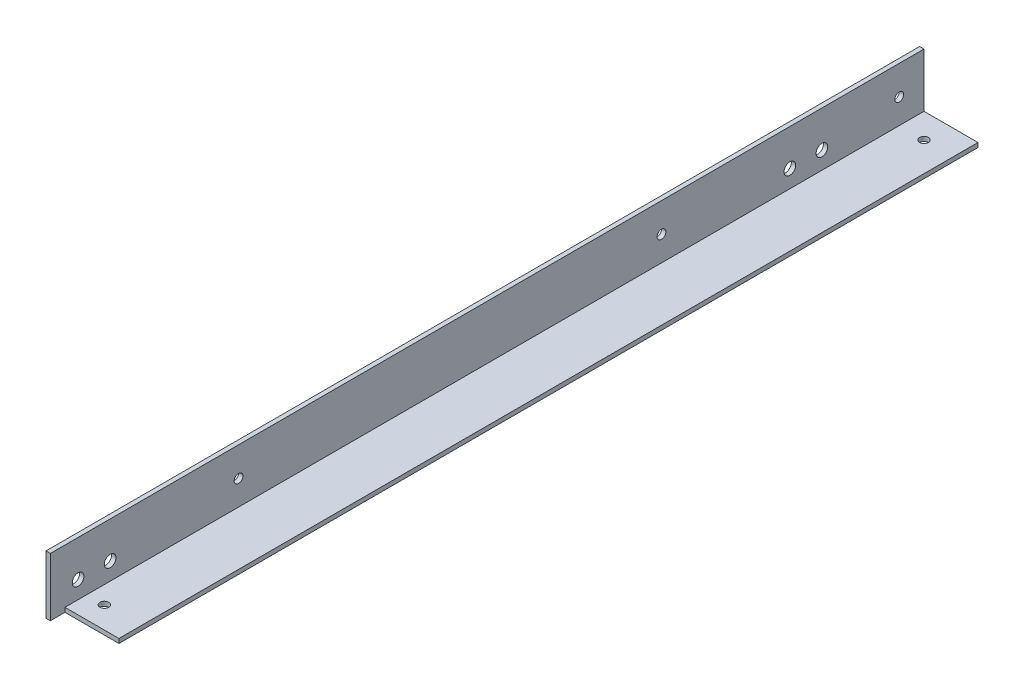
ISO-10303-21;
HEADER;
FILE_DESCRIPTION(('STEP AP214'),'2;1');
FILE_NAME('part.step','',(''),(''),'','','');
FILE_SCHEMA(('AUTOMOTIVE_DESIGN { 1 0 10303 214 1 1 1 1 }'));
ENDSEC;
DATA;
#1=APPLICATION_CONTEXT('core data for automotive mechanical design processes');
#2=APPLICATION_PROTOCOL_DEFINITION('international standard','automotive_design',2000,#1);
#3=PRODUCT_CONTEXT('',#1,'mechanical');
#4=PRODUCT('Part','Part','',(#3));
#5=PRODUCT_RELATED_PRODUCT_CATEGORY('part','',(#4));
#6=PRODUCT_DEFINITION_FORMATION('','',#4);
#7=PRODUCT_DEFINITION_CONTEXT('part definition',#1,'design');
#8=PRODUCT_DEFINITION('design','',#6,#7);
#9=PRODUCT_DEFINITION_SHAPE('','',#8);
#10=(LENGTH_UNIT() NAMED_UNIT(*) SI_UNIT(.MILLI.,.METRE.));
#11=(NAMED_UNIT(*) PLANE_ANGLE_UNIT() SI_UNIT($,.RADIAN.));
#12=(NAMED_UNIT(*) SI_UNIT($,.STERADIAN.) SOLID_ANGLE_UNIT());
#13=UNCERTAINTY_MEASURE_WITH_UNIT(LENGTH_MEASURE(1.E-05),#10,'distance_accuracy_value','');
#14=(GEOMETRIC_REPRESENTATION_CONTEXT(3) GLOBAL_UNCERTAINTY_ASSIGNED_CONTEXT((#13)) GLOBAL_UNIT_ASSIGNED_CONTEXT((#10,
#11,#12)) REPRESENTATION_CONTEXT('',''));
#15=CARTESIAN_POINT('',(0.,0.,0.));
#16=DIRECTION('',(0.,0.,1.));
#17=DIRECTION('',(1.,0.,0.));
#18=AXIS2_PLACEMENT_3D('',#15,#16,#17);
#19=CARTESIAN_POINT('',(-15.9316863798358,4.77336842105263,294.5));
#20=DIRECTION('',(0.,-1.,0.));
#21=DIRECTION('',(1.,0.,0.));
#22=AXIS2_PLACEMENT_3D('',#19,#20,#21);
#23=PLANE('',#22);
#24=DIRECTION('',(-1.,0.,0.));
#25=VECTOR('',#24,1.);
#26=CARTESIAN_POINT('',(-15.9316863798358,4.77336842105263,0.));
#27=LINE('',#26,#25);
#28=CARTESIAN_POINT('',(-15.9316863798358,4.77336842105263,0.));
#29=VERTEX_POINT('',#28);
#30=CARTESIAN_POINT('',(-17.4316863798358,4.77336842105263,0.));
#31=VERTEX_POINT('',#30);
#32=EDGE_CURVE('E177',#29,#31,#27,.T.);
#33=ORIENTED_EDGE('',*,*,#32,.T.);
#34=DIRECTION('',(0.,0.,-1.));
#35=VECTOR('',#34,1.);
#36=CARTESIAN_POINT('',(-17.4316863798358,4.77336842105263,294.5));
#37=LINE('',#36,#35);
#38=CARTESIAN_POINT('',(-17.4316863798358,4.77336842105263,299.5));
#39=VERTEX_POINT('',#38);
#40=EDGE_CURVE('E11',#39,#31,#37,.T.);
#41=ORIENTED_EDGE('',*,*,#40,.F.);
#42=DIRECTION('',(-1.,0.,0.));
#43=VECTOR('',#42,1.);
#44=CARTESIAN_POINT('',(-17.4316863798358,4.77336842105263,299.5));
#45=LINE('',#44,#43);
#46=CARTESIAN_POINT('',(-15.9316863798358,4.77336842105263,299.5));
#47=VERTEX_POINT('',#46);
#48=EDGE_CURVE('E119',#47,#39,#45,.T.);
#49=ORIENTED_EDGE('',*,*,#48,.F.);
#50=DIRECTION('',(0.,0.,-1.));
#51=VECTOR('',#50,1.);
#52=CARTESIAN_POINT('',(-15.9316863798358,4.77336842105263,294.5));
#53=LINE('',#52,#51);
#54=EDGE_CURVE('E185',#47,#29,#53,.T.);
#55=ORIENTED_EDGE('',*,*,#54,.T.);
#56=EDGE_LOOP('',(#33,#41,#49,#55));
#57=FACE_BOUND('',#56,.T.);
#58=ADVANCED_FACE('F31',(#57),#23,.F.);
#59=CARTESIAN_POINT('',(-17.4316863798358,4.77336842105263,294.5));
#60=DIRECTION('',(1.,0.,0.));
#61=DIRECTION('',(0.,1.,0.));
#62=AXIS2_PLACEMENT_3D('',#59,#60,#61);
#63=PLANE('',#62);
#64=CARTESIAN_POINT('',(-17.4316863798358,-5.22663157894737,90.));
#65=DIRECTION('',(1.,0.,0.));
#66=DIRECTION('',(0.,1.,0.));
#67=AXIS2_PLACEMENT_3D('',#64,#65,#66);
#68=CIRCLE('',#67,1.5);
#69=CARTESIAN_POINT('',(-17.4316863798358,-3.72663157894737,90.));
#70=VERTEX_POINT('',#69);
#71=EDGE_CURVE('E132',#70,#70,#68,.T.);
#72=ORIENTED_EDGE('',*,*,#71,.T.);
#73=EDGE_LOOP('',(#72));
#74=FACE_BOUND('',#73,.T.);
#75=CARTESIAN_POINT('',(-17.4316863798358,-5.22663157894737,235.));
#76=DIRECTION('',(1.,0.,0.));
#77=DIRECTION('',(0.,1.,0.));
#78=AXIS2_PLACEMENT_3D('',#75,#76,#77);
#79=CIRCLE('',#78,1.50000000000003);
#80=CARTESIAN_POINT('',(-17.4316863798358,-3.72663157894734,235.));
#81=VERTEX_POINT('',#80);
#82=EDGE_CURVE('E138',#81,#81,#79,.T.);
#83=ORIENTED_EDGE('',*,*,#82,.T.);
#84=EDGE_LOOP('',(#83));
#85=FACE_BOUND('',#84,.T.);
#86=CARTESIAN_POINT('',(-17.4316863798358,-7.72663157894737,46.));
#87=DIRECTION('',(1.,0.,0.));
#88=DIRECTION('',(0.,1.,0.));
#89=AXIS2_PLACEMENT_3D('',#86,#87,#88);
#90=CIRCLE('',#89,2.);
#91=CARTESIAN_POINT('',(-17.4316863798358,-5.72663157894737,46.));
#92=VERTEX_POINT('',#91);
#93=EDGE_CURVE('E144',#92,#92,#90,.T.);
#94=ORIENTED_EDGE('',*,*,#93,.T.);
#95=EDGE_LOOP('',(#94));
#96=FACE_BOUND('',#95,.T.);
#97=CARTESIAN_POINT('',(-17.4316863798358,-7.72663157894737,35.));
#98=DIRECTION('',(1.,0.,0.));
#99=DIRECTION('',(0.,1.,0.));
#100=AXIS2_PLACEMENT_3D('',#97,#98,#99);
#101=CIRCLE('',#100,2.);
#102=CARTESIAN_POINT('',(-17.4316863798358,-5.72663157894737,35.));
#103=VERTEX_POINT('',#102);
#104=EDGE_CURVE('E150',#103,#103,#101,.T.);
#105=ORIENTED_EDGE('',*,*,#104,.T.);
#106=EDGE_LOOP('',(#105));
#107=FACE_BOUND('',#106,.T.);
#108=CARTESIAN_POINT('',(-17.4316863798358,-7.72663157894737,279.));
#109=DIRECTION('',(1.,0.,0.));
#110=DIRECTION('',(0.,1.,0.));
#111=AXIS2_PLACEMENT_3D('',#108,#109,#110);
#112=CIRCLE('',#111,2.);
#113=CARTESIAN_POINT('',(-17.4316863798358,-5.72663157894738,279.));
#114=VERTEX_POINT('',#113);
#115=EDGE_CURVE('E156',#114,#114,#112,.T.);
#116=ORIENTED_EDGE('',*,*,#115,.T.);
#117=EDGE_LOOP('',(#116));
#118=FACE_BOUND('',#117,.T.);
#119=CARTESIAN_POINT('',(-17.4316863798358,-7.72663157894737,290.));
#120=DIRECTION('',(1.,0.,0.));
#121=DIRECTION('',(0.,1.,0.));
#122=AXIS2_PLACEMENT_3D('',#119,#120,#121);
#123=CIRCLE('',#122,2.);
#124=CARTESIAN_POINT('',(-17.4316863798358,-5.72663157894738,290.));
#125=VERTEX_POINT('',#124);
#126=EDGE_CURVE('E162',#125,#125,#123,.T.);
#127=ORIENTED_EDGE('',*,*,#126,.T.);
#128=EDGE_LOOP('',(#127));
#129=FACE_BOUND('',#128,.T.);
#130=CARTESIAN_POINT('',(-17.4316863798358,-5.22663157894737,8.50000000000001));
#131=DIRECTION('',(1.,0.,0.));
#132=DIRECTION('',(0.,1.,0.));
#133=AXIS2_PLACEMENT_3D('',#130,#131,#132);
#134=CIRCLE('',#133,1.5);
#135=CARTESIAN_POINT('',(-17.4316863798358,-3.72663157894737,8.50000000000001));
#136=VERTEX_POINT('',#135);
#137=EDGE_CURVE('E168',#136,#136,#134,.T.);
#138=ORIENTED_EDGE('',*,*,#137,.T.);
#139=EDGE_LOOP('',(#138));
#140=FACE_BOUND('',#139,.T.);
#141=DIRECTION('',(0.,-1.,0.));
#142=VECTOR('',#141,1.);
#143=CARTESIAN_POINT('',(-17.4316863798358,4.77336842105263,0.));
#144=LINE('',#143,#142);
#145=CARTESIAN_POINT('',(-17.4316863798357,-15.2266315789474,0.));
#146=VERTEX_POINT('',#145);
#147=EDGE_CURVE('E101',#31,#146,#144,.T.);
#148=ORIENTED_EDGE('',*,*,#147,.T.);
#149=DIRECTION('',(0.,0.,-1.));
#150=VECTOR('',#149,1.);
#151=CARTESIAN_POINT('',(-17.4316863798357,-15.2266315789474,294.5));
#152=LINE('',#151,#150);
#153=CARTESIAN_POINT('',(-17.4316863798358,-15.2266315789474,299.5));
#154=VERTEX_POINT('',#153);
#155=EDGE_CURVE('E39',#154,#146,#152,.T.);
#156=ORIENTED_EDGE('',*,*,#155,.F.);
#157=DIRECTION('',(0.,-1.,0.));
#158=VECTOR('',#157,1.);
#159=CARTESIAN_POINT('',(-17.4316863798358,4.77336842105263,299.5));
#160=LINE('',#159,#158);
#161=EDGE_CURVE('E100',#39,#154,#160,.T.);
#162=ORIENTED_EDGE('',*,*,#161,.F.);
#163=ORIENTED_EDGE('',*,*,#40,.T.);
#164=EDGE_LOOP('',(#148,#156,#162,#163));
#165=FACE_BOUND('',#164,.T.);
#166=ADVANCED_FACE('F98',(#74,#85,#96,#107,#118,#129,#140,#165),#63,.F.);
#167=CARTESIAN_POINT('',(-17.4316863798357,-15.2266315789474,294.5));
#168=DIRECTION('',(0.,1.,0.));
#169=DIRECTION('',(0.,0.,1.));
#170=AXIS2_PLACEMENT_3D('',#167,#168,#169);
#171=PLANE('',#170);
#172=CARTESIAN_POINT('',(-9.93168637983575,-15.2266315789474,287.));
#173=DIRECTION('',(0.,-1.,0.));
#174=DIRECTION('',(0.,0.,-1.));
#175=AXIS2_PLACEMENT_3D('',#172,#173,#174);
#176=CIRCLE('',#175,1.5);
#177=CARTESIAN_POINT('',(-9.93168637983575,-15.2266315789474,285.5));
#178=VERTEX_POINT('',#177);
#179=EDGE_CURVE('E123',#178,#178,#176,.T.);
#180=ORIENTED_EDGE('',*,*,#179,.F.);
#181=EDGE_LOOP('',(#180));
#182=FACE_BOUND('',#181,.T.);
#183=CARTESIAN_POINT('',(-7.43168637983575,-15.2266315789474,8.50000000000001));
#184=DIRECTION('',(0.,1.,0.));
#185=DIRECTION('',(0.,0.,1.));
#186=AXIS2_PLACEMENT_3D('',#183,#184,#185);
#187=CIRCLE('',#186,1.5);
#188=CARTESIAN_POINT('',(-7.43168637983575,-15.2266315789474,10.));
#189=VERTEX_POINT('',#188);
#190=EDGE_CURVE('E174',#189,#189,#187,.T.);
#191=ORIENTED_EDGE('',*,*,#190,.T.);
#192=EDGE_LOOP('',(#191));
#193=FACE_BOUND('',#192,.T.);
#194=DIRECTION('',(1.,0.,0.));
#195=VECTOR('',#194,1.);
#196=CARTESIAN_POINT('',(-17.4316863798357,-15.2266315789474,0.));
#197=LINE('',#196,#195);
#198=CARTESIAN_POINT('',(2.56831362016425,-15.2266315789474,0.));
#199=VERTEX_POINT('',#198);
#200=EDGE_CURVE('E199',#146,#199,#197,.T.);
#201=ORIENTED_EDGE('',*,*,#200,.T.);
#202=DIRECTION('',(0.,0.,-1.));
#203=VECTOR('',#202,1.);
#204=CARTESIAN_POINT('',(2.56831362016425,-15.2266315789474,294.5));
#205=LINE('',#204,#203);
#206=CARTESIAN_POINT('',(2.56831362016425,-15.2266315789474,294.5));
#207=VERTEX_POINT('',#206);
#208=EDGE_CURVE('E104',#207,#199,#205,.T.);
#209=ORIENTED_EDGE('',*,*,#208,.F.);
#210=DIRECTION('',(1.,0.,0.));
#211=VECTOR('',#210,1.);
#212=CARTESIAN_POINT('',(-17.4316863798357,-15.2266315789474,294.5));
#213=LINE('',#212,#211);
#214=CARTESIAN_POINT('',(-15.9316863798358,-15.2266315789474,294.5));
#215=VERTEX_POINT('',#214);
#216=EDGE_CURVE('E82',#215,#207,#213,.T.);
#217=ORIENTED_EDGE('',*,*,#216,.F.);
#218=DIRECTION('',(0.,0.,-1.));
#219=VECTOR('',#218,1.);
#220=CARTESIAN_POINT('',(-15.9316863798357,-15.2266315789474,299.5));
#221=LINE('',#220,#219);
#222=CARTESIAN_POINT('',(-15.9316863798357,-15.2266315789474,299.5));
#223=VERTEX_POINT('',#222);
#224=EDGE_CURVE('E110',#223,#215,#221,.T.);
#225=ORIENTED_EDGE('',*,*,#224,.F.);
#226=DIRECTION('',(1.,0.,0.));
#227=VECTOR('',#226,1.);
#228=CARTESIAN_POINT('',(-17.4316863798358,-15.2266315789474,299.5));
#229=LINE('',#228,#227);
#230=EDGE_CURVE('E107',#154,#223,#229,.T.);
#231=ORIENTED_EDGE('',*,*,#230,.F.);
#232=ORIENTED_EDGE('',*,*,#155,.T.);
#233=EDGE_LOOP('',(#201,#209,#217,#225,#231,#232));
#234=FACE_BOUND('',#233,.T.);
#235=ADVANCED_FACE('F108',(#182,#193,#234),#171,.F.);
#236=CARTESIAN_POINT('',(2.56831362016425,-15.2266315789474,294.5));
#237=DIRECTION('',(-1.,0.,0.));
#238=DIRECTION('',(0.,0.,1.));
#239=AXIS2_PLACEMENT_3D('',#236,#237,#238);
#240=PLANE('',#239);
#241=DIRECTION('',(0.,1.,0.));
#242=VECTOR('',#241,1.);
#243=CARTESIAN_POINT('',(2.56831362016425,-15.2266315789474,0.));
#244=LINE('',#243,#242);
#245=CARTESIAN_POINT('',(2.56831362016425,-13.7266315789474,0.));
#246=VERTEX_POINT('',#245);
#247=EDGE_CURVE('E203',#199,#246,#244,.T.);
#248=ORIENTED_EDGE('',*,*,#247,.T.);
#249=DIRECTION('',(0.,0.,-1.));
#250=VECTOR('',#249,1.);
#251=CARTESIAN_POINT('',(2.56831362016425,-13.7266315789474,294.5));
#252=LINE('',#251,#250);
#253=CARTESIAN_POINT('',(2.56831362016425,-13.7266315789474,294.5));
#254=VERTEX_POINT('',#253);
#255=EDGE_CURVE('E190',#254,#246,#252,.T.);
#256=ORIENTED_EDGE('',*,*,#255,.F.);
#257=DIRECTION('',(0.,1.,0.));
#258=VECTOR('',#257,1.);
#259=CARTESIAN_POINT('',(2.56831362016425,-15.2266315789474,294.5));
#260=LINE('',#259,#258);
#261=EDGE_CURVE('E180',#207,#254,#260,.T.);
#262=ORIENTED_EDGE('',*,*,#261,.F.);
#263=ORIENTED_EDGE('',*,*,#208,.T.);
#264=EDGE_LOOP('',(#248,#256,#262,#263));
#265=FACE_BOUND('',#264,.T.);
#266=ADVANCED_FACE('F215',(#265),#240,.F.);
#267=CARTESIAN_POINT('',(2.56831362016425,-13.7266315789474,294.5));
#268=DIRECTION('',(0.,-1.,0.));
#269=DIRECTION('',(1.,0.,0.));
#270=AXIS2_PLACEMENT_3D('',#267,#268,#269);
#271=PLANE('',#270);
#272=CARTESIAN_POINT('',(-9.93168637983575,-13.7266315789474,287.));
#273=DIRECTION('',(0.,-1.,0.));
#274=DIRECTION('',(1.,0.,0.));
#275=AXIS2_PLACEMENT_3D('',#272,#273,#274);
#276=CIRCLE('',#275,1.5);
#277=CARTESIAN_POINT('',(-8.43168637983575,-13.7266315789474,287.));
#278=VERTEX_POINT('',#277);
#279=EDGE_CURVE('E34',#278,#278,#276,.T.);
#280=ORIENTED_EDGE('',*,*,#279,.T.);
#281=EDGE_LOOP('',(#280));
#282=FACE_BOUND('',#281,.T.);
#283=CARTESIAN_POINT('',(-7.43168637983575,-13.7266315789474,8.50000000000001));
#284=DIRECTION('',(0.,1.,0.));
#285=DIRECTION('',(-1.,0.,0.));
#286=AXIS2_PLACEMENT_3D('',#283,#284,#285);
#287=CIRCLE('',#286,1.5);
#288=CARTESIAN_POINT('',(-8.93168637983575,-13.7266315789474,8.50000000000001));
#289=VERTEX_POINT('',#288);
#290=EDGE_CURVE('E171',#289,#289,#287,.T.);
#291=ORIENTED_EDGE('',*,*,#290,.F.);
#292=EDGE_LOOP('',(#291));
#293=FACE_BOUND('',#292,.T.);
#294=DIRECTION('',(-1.,0.,0.));
#295=VECTOR('',#294,1.);
#296=CARTESIAN_POINT('',(2.56831362016425,-13.7266315789474,0.));
#297=LINE('',#296,#295);
#298=CARTESIAN_POINT('',(-15.9316863798358,-13.7266315789474,0.));
#299=VERTEX_POINT('',#298);
#300=EDGE_CURVE('E205',#246,#299,#297,.T.);
#301=ORIENTED_EDGE('',*,*,#300,.T.);
#302=DIRECTION('',(0.,0.,-1.));
#303=VECTOR('',#302,1.);
#304=CARTESIAN_POINT('',(-15.9316863798358,-13.7266315789474,294.5));
#305=LINE('',#304,#303);
#306=CARTESIAN_POINT('',(-15.9316863798358,-13.7266315789474,294.5));
#307=VERTEX_POINT('',#306);
#308=EDGE_CURVE('E188',#307,#299,#305,.T.);
#309=ORIENTED_EDGE('',*,*,#308,.F.);
#310=DIRECTION('',(-1.,0.,0.));
#311=VECTOR('',#310,1.);
#312=CARTESIAN_POINT('',(2.56831362016425,-13.7266315789474,294.5));
#313=LINE('',#312,#311);
#314=EDGE_CURVE('E53',#254,#307,#313,.T.);
#315=ORIENTED_EDGE('',*,*,#314,.F.);
#316=ORIENTED_EDGE('',*,*,#255,.T.);
#317=EDGE_LOOP('',(#301,#309,#315,#316));
#318=FACE_BOUND('',#317,.T.);
#319=ADVANCED_FACE('F220',(#282,#293,#318),#271,.F.);
#320=CARTESIAN_POINT('',(-15.9316863798358,-13.7266315789474,294.5));
#321=DIRECTION('',(-1.,0.,0.));
#322=DIRECTION('',(0.,0.,1.));
#323=AXIS2_PLACEMENT_3D('',#320,#321,#322);
#324=PLANE('',#323);
#325=CARTESIAN_POINT('',(-15.9316863798358,-5.22663157894737,90.));
#326=DIRECTION('',(1.,0.,0.));
#327=DIRECTION('',(0.,0.,-1.));
#328=AXIS2_PLACEMENT_3D('',#325,#326,#327);
#329=CIRCLE('',#328,1.5);
#330=CARTESIAN_POINT('',(-15.9316863798358,-5.22663157894737,88.5));
#331=VERTEX_POINT('',#330);
#332=EDGE_CURVE('E129',#331,#331,#329,.T.);
#333=ORIENTED_EDGE('',*,*,#332,.F.);
#334=EDGE_LOOP('',(#333));
#335=FACE_BOUND('',#334,.T.);
#336=CARTESIAN_POINT('',(-15.9316863798358,-5.22663157894737,235.));
#337=DIRECTION('',(1.,0.,0.));
#338=DIRECTION('',(0.,0.,-1.));
#339=AXIS2_PLACEMENT_3D('',#336,#337,#338);
#340=CIRCLE('',#339,1.50000000000003);
#341=CARTESIAN_POINT('',(-15.9316863798358,-5.22663157894737,233.5));
#342=VERTEX_POINT('',#341);
#343=EDGE_CURVE('E135',#342,#342,#340,.T.);
#344=ORIENTED_EDGE('',*,*,#343,.F.);
#345=EDGE_LOOP('',(#344));
#346=FACE_BOUND('',#345,.T.);
#347=CARTESIAN_POINT('',(-15.9316863798358,-7.72663157894737,46.));
#348=DIRECTION('',(1.,0.,0.));
#349=DIRECTION('',(0.,0.,-1.));
#350=AXIS2_PLACEMENT_3D('',#347,#348,#349);
#351=CIRCLE('',#350,2.);
#352=CARTESIAN_POINT('',(-15.9316863798358,-7.72663157894737,44.));
#353=VERTEX_POINT('',#352);
#354=EDGE_CURVE('E141',#353,#353,#351,.T.);
#355=ORIENTED_EDGE('',*,*,#354,.F.);
#356=EDGE_LOOP('',(#355));
#357=FACE_BOUND('',#356,.T.);
#358=CARTESIAN_POINT('',(-15.9316863798358,-7.72663157894737,35.));
#359=DIRECTION('',(1.,0.,0.));
#360=DIRECTION('',(0.,0.,-1.));
#361=AXIS2_PLACEMENT_3D('',#358,#359,#360);
#362=CIRCLE('',#361,2.);
#363=CARTESIAN_POINT('',(-15.9316863798358,-7.72663157894737,33.));
#364=VERTEX_POINT('',#363);
#365=EDGE_CURVE('E147',#364,#364,#362,.T.);
#366=ORIENTED_EDGE('',*,*,#365,.F.);
#367=EDGE_LOOP('',(#366));
#368=FACE_BOUND('',#367,.T.);
#369=CARTESIAN_POINT('',(-15.9316863798358,-7.72663157894737,279.));
#370=DIRECTION('',(1.,0.,0.));
#371=DIRECTION('',(0.,0.,-1.));
#372=AXIS2_PLACEMENT_3D('',#369,#370,#371);
#373=CIRCLE('',#372,2.);
#374=CARTESIAN_POINT('',(-15.9316863798358,-7.72663157894737,277.));
#375=VERTEX_POINT('',#374);
#376=EDGE_CURVE('E153',#375,#375,#373,.T.);
#377=ORIENTED_EDGE('',*,*,#376,.F.);
#378=EDGE_LOOP('',(#377));
#379=FACE_BOUND('',#378,.T.);
#380=CARTESIAN_POINT('',(-15.9316863798358,-7.72663157894737,290.));
#381=DIRECTION('',(1.,0.,0.));
#382=DIRECTION('',(0.,0.,-1.));
#383=AXIS2_PLACEMENT_3D('',#380,#381,#382);
#384=CIRCLE('',#383,2.);
#385=CARTESIAN_POINT('',(-15.9316863798358,-7.72663157894737,288.));
#386=VERTEX_POINT('',#385);
#387=EDGE_CURVE('E159',#386,#386,#384,.T.);
#388=ORIENTED_EDGE('',*,*,#387,.F.);
#389=EDGE_LOOP('',(#388));
#390=FACE_BOUND('',#389,.T.);
#391=CARTESIAN_POINT('',(-15.9316863798358,-5.22663157894737,8.50000000000001));
#392=DIRECTION('',(1.,0.,0.));
#393=DIRECTION('',(0.,0.,-1.));
#394=AXIS2_PLACEMENT_3D('',#391,#392,#393);
#395=CIRCLE('',#394,1.5);
#396=CARTESIAN_POINT('',(-15.9316863798358,-5.22663157894737,7.00000000000001));
#397=VERTEX_POINT('',#396);
#398=EDGE_CURVE('E165',#397,#397,#395,.T.);
#399=ORIENTED_EDGE('',*,*,#398,.F.);
#400=EDGE_LOOP('',(#399));
#401=FACE_BOUND('',#400,.T.);
#402=DIRECTION('',(0.,1.,0.));
#403=VECTOR('',#402,1.);
#404=CARTESIAN_POINT('',(-15.9316863798358,-13.7266315789474,0.));
#405=LINE('',#404,#403);
#406=EDGE_CURVE('E80',#299,#29,#405,.T.);
#407=ORIENTED_EDGE('',*,*,#406,.T.);
#408=ORIENTED_EDGE('',*,*,#54,.F.);
#409=DIRECTION('',(0.,1.,0.));
#410=VECTOR('',#409,1.);
#411=CARTESIAN_POINT('',(-15.9316863798358,4.77336842105263,299.5));
#412=LINE('',#411,#410);
#413=EDGE_CURVE('E114',#223,#47,#412,.T.);
#414=ORIENTED_EDGE('',*,*,#413,.F.);
#415=ORIENTED_EDGE('',*,*,#224,.T.);
#416=DIRECTION('',(0.,1.,0.));
#417=VECTOR('',#416,1.);
#418=CARTESIAN_POINT('',(-15.9316863798358,4.77336842105263,294.5));
#419=LINE('',#418,#417);
#420=EDGE_CURVE('E47',#215,#307,#419,.T.);
#421=ORIENTED_EDGE('',*,*,#420,.T.);
#422=ORIENTED_EDGE('',*,*,#308,.T.);
#423=EDGE_LOOP('',(#407,#408,#414,#415,#421,#422));
#424=FACE_BOUND('',#423,.T.);
#425=ADVANCED_FACE('F194',(#335,#346,#357,#368,#379,#390,#401,#424),#324,.F.);
#426=CARTESIAN_POINT('',(-17.4316863798358,4.77336842105263,294.5));
#427=DIRECTION('',(0.,0.,1.));
#428=DIRECTION('',(1.,0.,0.));
#429=AXIS2_PLACEMENT_3D('',#426,#427,#428);
#430=PLANE('',#429);
#431=ORIENTED_EDGE('',*,*,#420,.F.);
#432=ORIENTED_EDGE('',*,*,#216,.T.);
#433=ORIENTED_EDGE('',*,*,#261,.T.);
#434=ORIENTED_EDGE('',*,*,#314,.T.);
#435=EDGE_LOOP('',(#431,#432,#433,#434));
#436=FACE_BOUND('',#435,.T.);
#437=ADVANCED_FACE('F228',(#436),#430,.T.);
#438=CARTESIAN_POINT('',(-17.4316863798358,4.77336842105263,0.));
#439=DIRECTION('',(0.,0.,1.));
#440=DIRECTION('',(1.,0.,0.));
#441=AXIS2_PLACEMENT_3D('',#438,#439,#440);
#442=PLANE('',#441);
#443=ORIENTED_EDGE('',*,*,#32,.F.);
#444=ORIENTED_EDGE('',*,*,#406,.F.);
#445=ORIENTED_EDGE('',*,*,#300,.F.);
#446=ORIENTED_EDGE('',*,*,#247,.F.);
#447=ORIENTED_EDGE('',*,*,#200,.F.);
#448=ORIENTED_EDGE('',*,*,#147,.F.);
#449=EDGE_LOOP('',(#443,#444,#445,#446,#447,#448));
#450=FACE_BOUND('',#449,.T.);
#451=ADVANCED_FACE('F218',(#450),#442,.F.);
#452=CARTESIAN_POINT('',(-7.43168637983563,-313.726631578947,8.50000000000001));
#453=DIRECTION('',(0.,1.,0.));
#454=DIRECTION('',(-1.,0.,0.));
#455=AXIS2_PLACEMENT_3D('',#452,#453,#454);
#456=CYLINDRICAL_SURFACE('',#455,1.5);
#457=ORIENTED_EDGE('',*,*,#290,.T.);
#458=EDGE_LOOP('',(#457));
#459=FACE_BOUND('',#458,.T.);
#460=ORIENTED_EDGE('',*,*,#190,.F.);
#461=EDGE_LOOP('',(#460));
#462=FACE_BOUND('',#461,.T.);
#463=ADVANCED_FACE('F261',(#459,#462),#456,.F.);
#464=CARTESIAN_POINT('',(-315.931686379836,-5.22663157894737,8.50000000000001));
#465=DIRECTION('',(1.,0.,0.));
#466=DIRECTION('',(0.,0.,-1.));
#467=AXIS2_PLACEMENT_3D('',#464,#465,#466);
#468=CYLINDRICAL_SURFACE('',#467,1.5);
#469=ORIENTED_EDGE('',*,*,#398,.T.);
#470=EDGE_LOOP('',(#469));
#471=FACE_BOUND('',#470,.T.);
#472=ORIENTED_EDGE('',*,*,#137,.F.);
#473=EDGE_LOOP('',(#472));
#474=FACE_BOUND('',#473,.T.);
#475=ADVANCED_FACE('F258',(#471,#474),#468,.F.);
#476=CARTESIAN_POINT('',(-315.931686379836,-7.72663157894737,290.));
#477=DIRECTION('',(1.,0.,0.));
#478=DIRECTION('',(0.,0.,-1.));
#479=AXIS2_PLACEMENT_3D('',#476,#477,#478);
#480=CYLINDRICAL_SURFACE('',#479,2.);
#481=ORIENTED_EDGE('',*,*,#387,.T.);
#482=EDGE_LOOP('',(#481));
#483=FACE_BOUND('',#482,.T.);
#484=ORIENTED_EDGE('',*,*,#126,.F.);
#485=EDGE_LOOP('',(#484));
#486=FACE_BOUND('',#485,.T.);
#487=ADVANCED_FACE('F260',(#483,#486),#480,.F.);
#488=CARTESIAN_POINT('',(-315.931686379836,-7.72663157894737,279.));
#489=DIRECTION('',(1.,0.,0.));
#490=DIRECTION('',(0.,0.,-1.));
#491=AXIS2_PLACEMENT_3D('',#488,#489,#490);
#492=CYLINDRICAL_SURFACE('',#491,2.);
#493=ORIENTED_EDGE('',*,*,#376,.T.);
#494=EDGE_LOOP('',(#493));
#495=FACE_BOUND('',#494,.T.);
#496=ORIENTED_EDGE('',*,*,#115,.F.);
#497=EDGE_LOOP('',(#496));
#498=FACE_BOUND('',#497,.T.);
#499=ADVANCED_FACE('F268',(#495,#498),#492,.F.);
#500=CARTESIAN_POINT('',(-315.931686379836,-7.72663157894737,35.));
#501=DIRECTION('',(1.,0.,0.));
#502=DIRECTION('',(0.,0.,-1.));
#503=AXIS2_PLACEMENT_3D('',#500,#501,#502);
#504=CYLINDRICAL_SURFACE('',#503,2.);
#505=ORIENTED_EDGE('',*,*,#365,.T.);
#506=EDGE_LOOP('',(#505));
#507=FACE_BOUND('',#506,.T.);
#508=ORIENTED_EDGE('',*,*,#104,.F.);
#509=EDGE_LOOP('',(#508));
#510=FACE_BOUND('',#509,.T.);
#511=ADVANCED_FACE('F306',(#507,#510),#504,.F.);
#512=CARTESIAN_POINT('',(-315.931686379836,-7.72663157894737,46.));
#513=DIRECTION('',(1.,0.,0.));
#514=DIRECTION('',(0.,0.,-1.));
#515=AXIS2_PLACEMENT_3D('',#512,#513,#514);
#516=CYLINDRICAL_SURFACE('',#515,2.);
#517=ORIENTED_EDGE('',*,*,#354,.T.);
#518=EDGE_LOOP('',(#517));
#519=FACE_BOUND('',#518,.T.);
#520=ORIENTED_EDGE('',*,*,#93,.F.);
#521=EDGE_LOOP('',(#520));
#522=FACE_BOUND('',#521,.T.);
#523=ADVANCED_FACE('F315',(#519,#522),#516,.F.);
#524=CARTESIAN_POINT('',(-315.931686379836,-5.22663157894737,235.));
#525=DIRECTION('',(1.,0.,0.));
#526=DIRECTION('',(0.,0.,-1.));
#527=AXIS2_PLACEMENT_3D('',#524,#525,#526);
#528=CYLINDRICAL_SURFACE('',#527,1.50000000000003);
#529=ORIENTED_EDGE('',*,*,#343,.T.);
#530=EDGE_LOOP('',(#529));
#531=FACE_BOUND('',#530,.T.);
#532=ORIENTED_EDGE('',*,*,#82,.F.);
#533=EDGE_LOOP('',(#532));
#534=FACE_BOUND('',#533,.T.);
#535=ADVANCED_FACE('F325',(#531,#534),#528,.F.);
#536=CARTESIAN_POINT('',(-315.931686379836,-5.22663157894737,90.));
#537=DIRECTION('',(1.,0.,0.));
#538=DIRECTION('',(0.,0.,-1.));
#539=AXIS2_PLACEMENT_3D('',#536,#537,#538);
#540=CYLINDRICAL_SURFACE('',#539,1.5);
#541=ORIENTED_EDGE('',*,*,#332,.T.);
#542=EDGE_LOOP('',(#541));
#543=FACE_BOUND('',#542,.T.);
#544=ORIENTED_EDGE('',*,*,#71,.F.);
#545=EDGE_LOOP('',(#544));
#546=FACE_BOUND('',#545,.T.);
#547=ADVANCED_FACE('F335',(#543,#546),#540,.F.);
#548=CARTESIAN_POINT('',(-17.4316863798358,-15.2266315789474,299.5));
#549=DIRECTION('',(0.,0.,1.));
#550=DIRECTION('',(1.,0.,0.));
#551=AXIS2_PLACEMENT_3D('',#548,#549,#550);
#552=PLANE('',#551);
#553=ORIENTED_EDGE('',*,*,#161,.T.);
#554=ORIENTED_EDGE('',*,*,#230,.T.);
#555=ORIENTED_EDGE('',*,*,#413,.T.);
#556=ORIENTED_EDGE('',*,*,#48,.T.);
#557=EDGE_LOOP('',(#553,#554,#555,#556));
#558=FACE_BOUND('',#557,.T.);
#559=ADVANCED_FACE('F117',(#558),#552,.T.);
#560=CARTESIAN_POINT('',(-9.93168637983575,-10.2266315789474,287.));
#561=DIRECTION('',(0.,-1.,0.));
#562=DIRECTION('',(0.,0.,-1.));
#563=AXIS2_PLACEMENT_3D('',#560,#561,#562);
#564=CYLINDRICAL_SURFACE('',#563,1.5);
#565=ORIENTED_EDGE('',*,*,#179,.T.);
#566=EDGE_LOOP('',(#565));
#567=FACE_BOUND('',#566,.T.);
#568=ORIENTED_EDGE('',*,*,#279,.F.);
#569=EDGE_LOOP('',(#568));
#570=FACE_BOUND('',#569,.T.);
#571=ADVANCED_FACE('F376',(#567,#570),#564,.F.);
#572=CLOSED_SHELL('',(#58,#166,#235,#266,#319,#425,#437,#451,#463,#475,#487,#499,#511,#523,#535,
#547,#559,#571));
#573=MANIFOLD_SOLID_BREP('B2',#572);
#574=ADVANCED_BREP_SHAPE_REPRESENTATION('',(#18,#573),#14);
#575=SHAPE_DEFINITION_REPRESENTATION(#9,#574);
ENDSEC;
END-ISO-10303-21;
